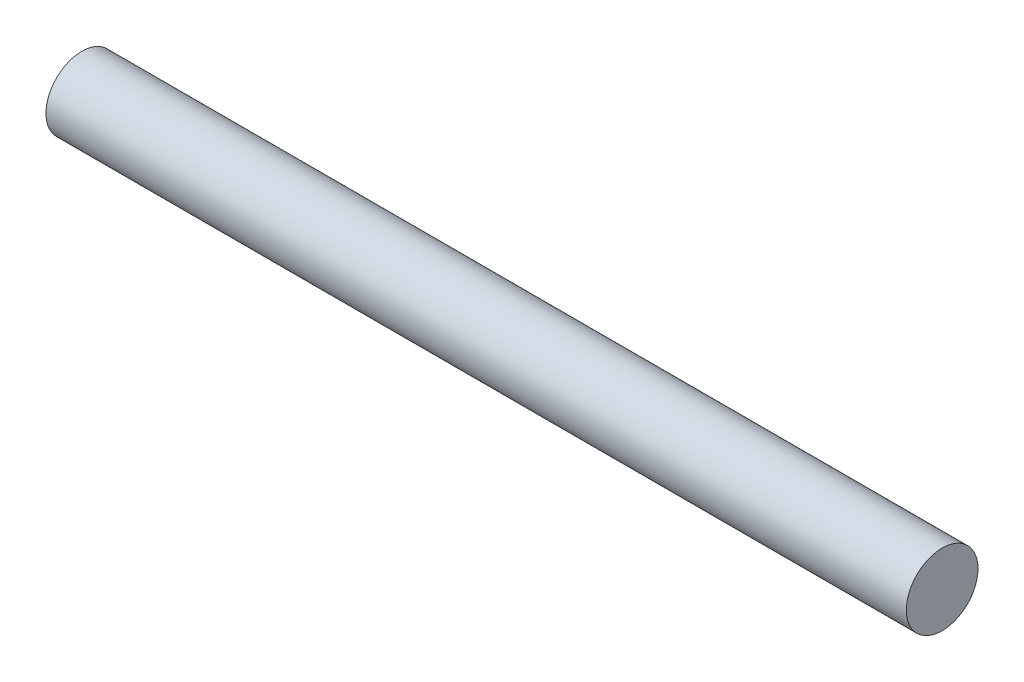
ISO-10303-21;
HEADER;
FILE_DESCRIPTION(('STEP AP214'),'2;1');
FILE_NAME('part.step','',(''),(''),'','','');
FILE_SCHEMA(('AUTOMOTIVE_DESIGN { 1 0 10303 214 1 1 1 1 }'));
ENDSEC;
DATA;
#1=APPLICATION_CONTEXT('core data for automotive mechanical design processes');
#2=APPLICATION_PROTOCOL_DEFINITION('international standard','automotive_design',2000,#1);
#3=PRODUCT_CONTEXT('',#1,'mechanical');
#4=PRODUCT('Part','Part','',(#3));
#5=PRODUCT_RELATED_PRODUCT_CATEGORY('part','',(#4));
#6=PRODUCT_DEFINITION_FORMATION('','',#4);
#7=PRODUCT_DEFINITION_CONTEXT('part definition',#1,'design');
#8=PRODUCT_DEFINITION('design','',#6,#7);
#9=PRODUCT_DEFINITION_SHAPE('','',#8);
#10=(LENGTH_UNIT() NAMED_UNIT(*) SI_UNIT(.MILLI.,.METRE.));
#11=(NAMED_UNIT(*) PLANE_ANGLE_UNIT() SI_UNIT($,.RADIAN.));
#12=(NAMED_UNIT(*) SI_UNIT($,.STERADIAN.) SOLID_ANGLE_UNIT());
#13=UNCERTAINTY_MEASURE_WITH_UNIT(LENGTH_MEASURE(1.E-05),#10,'distance_accuracy_value','');
#14=(GEOMETRIC_REPRESENTATION_CONTEXT(3) GLOBAL_UNCERTAINTY_ASSIGNED_CONTEXT((#13)) GLOBAL_UNIT_ASSIGNED_CONTEXT((#10,
#11,#12)) REPRESENTATION_CONTEXT('',''));
#15=CARTESIAN_POINT('',(0.,0.,0.));
#16=DIRECTION('',(0.,0.,1.));
#17=DIRECTION('',(1.,0.,0.));
#18=AXIS2_PLACEMENT_3D('',#15,#16,#17);
#19=CARTESIAN_POINT('',(-240.,-90.4,-82.3915));
#20=DIRECTION('',(1.,0.,0.));
#21=DIRECTION('',(0.,0.,-1.));
#22=AXIS2_PLACEMENT_3D('',#19,#20,#21);
#23=PLANE('',#22);
#24=CARTESIAN_POINT('',(-240.,-90.4,-82.3915));
#25=DIRECTION('',(1.,0.,0.));
#26=DIRECTION('',(0.,0.,-1.));
#27=AXIS2_PLACEMENT_3D('',#24,#25,#26);
#28=CIRCLE('',#27,20.);
#29=CARTESIAN_POINT('',(-240.,-90.4,-102.3915));
#30=VERTEX_POINT('',#29);
#31=EDGE_CURVE('E53',#30,#30,#28,.T.);
#32=ORIENTED_EDGE('',*,*,#31,.F.);
#33=EDGE_LOOP('',(#32));
#34=FACE_BOUND('',#33,.T.);
#35=ADVANCED_FACE('F47',(#34),#23,.F.);
#36=CARTESIAN_POINT('',(240.,-90.4,-82.3915));
#37=DIRECTION('',(1.,0.,0.));
#38=DIRECTION('',(0.,0.,-1.));
#39=AXIS2_PLACEMENT_3D('',#36,#37,#38);
#40=PLANE('',#39);
#41=CARTESIAN_POINT('',(240.,-90.4,-82.3915));
#42=DIRECTION('',(1.,0.,0.));
#43=DIRECTION('',(0.,0.,-1.));
#44=AXIS2_PLACEMENT_3D('',#41,#42,#43);
#45=CIRCLE('',#44,20.);
#46=CARTESIAN_POINT('',(240.,-90.4,-102.3915));
#47=VERTEX_POINT('',#46);
#48=EDGE_CURVE('E11',#47,#47,#45,.T.);
#49=ORIENTED_EDGE('',*,*,#48,.T.);
#50=EDGE_LOOP('',(#49));
#51=FACE_BOUND('',#50,.T.);
#52=ADVANCED_FACE('F62',(#51),#40,.T.);
#53=CARTESIAN_POINT('',(-240.,-90.4,-82.3915));
#54=DIRECTION('',(1.,0.,0.));
#55=DIRECTION('',(0.,0.,-1.));
#56=AXIS2_PLACEMENT_3D('',#53,#54,#55);
#57=CYLINDRICAL_SURFACE('',#56,20.);
#58=ORIENTED_EDGE('',*,*,#48,.F.);
#59=EDGE_LOOP('',(#58));
#60=FACE_BOUND('',#59,.T.);
#61=ORIENTED_EDGE('',*,*,#31,.T.);
#62=EDGE_LOOP('',(#61));
#63=FACE_BOUND('',#62,.T.);
#64=ADVANCED_FACE('F59',(#60,#63),#57,.T.);
#65=CLOSED_SHELL('',(#35,#52,#64));
#66=MANIFOLD_SOLID_BREP('B2',#65);
#67=ADVANCED_BREP_SHAPE_REPRESENTATION('',(#18,#66),#14);
#68=SHAPE_DEFINITION_REPRESENTATION(#9,#67);
ENDSEC;
END-ISO-10303-21;
